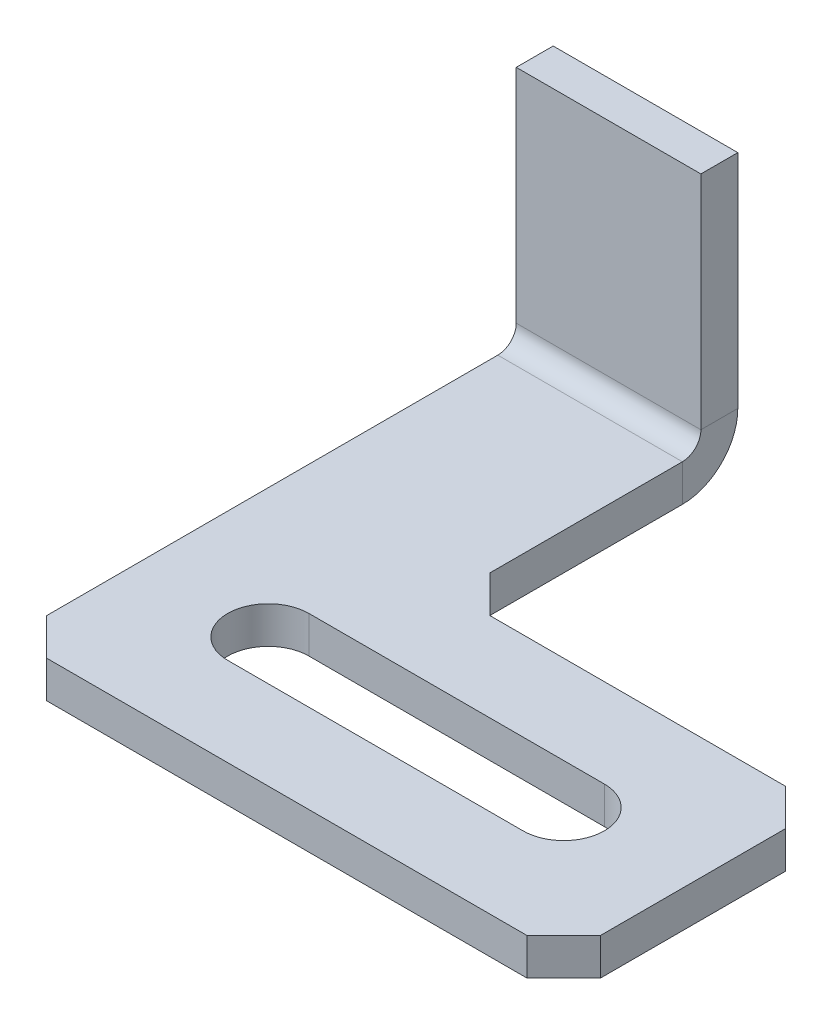
ISO-10303-21;
HEADER;
FILE_DESCRIPTION(('STEP AP214'),'2;1');
FILE_NAME('part.step','',(''),(''),'','','');
FILE_SCHEMA(('AUTOMOTIVE_DESIGN { 1 0 10303 214 1 1 1 1 }'));
ENDSEC;
DATA;
#1=APPLICATION_CONTEXT('core data for automotive mechanical design processes');
#2=APPLICATION_PROTOCOL_DEFINITION('international standard','automotive_design',2000,#1);
#3=PRODUCT_CONTEXT('',#1,'mechanical');
#4=PRODUCT('Part','Part','',(#3));
#5=PRODUCT_RELATED_PRODUCT_CATEGORY('part','',(#4));
#6=PRODUCT_DEFINITION_FORMATION('','',#4);
#7=PRODUCT_DEFINITION_CONTEXT('part definition',#1,'design');
#8=PRODUCT_DEFINITION('design','',#6,#7);
#9=PRODUCT_DEFINITION_SHAPE('','',#8);
#10=(LENGTH_UNIT() NAMED_UNIT(*) SI_UNIT(.MILLI.,.METRE.));
#11=(NAMED_UNIT(*) PLANE_ANGLE_UNIT() SI_UNIT($,.RADIAN.));
#12=(NAMED_UNIT(*) SI_UNIT($,.STERADIAN.) SOLID_ANGLE_UNIT());
#13=UNCERTAINTY_MEASURE_WITH_UNIT(LENGTH_MEASURE(1.E-05),#10,'distance_accuracy_value','');
#14=(GEOMETRIC_REPRESENTATION_CONTEXT(3) GLOBAL_UNCERTAINTY_ASSIGNED_CONTEXT((#13)) GLOBAL_UNIT_ASSIGNED_CONTEXT((#10,
#11,#12)) REPRESENTATION_CONTEXT('',''));
#15=CARTESIAN_POINT('',(0.,0.,0.));
#16=DIRECTION('',(0.,0.,1.));
#17=DIRECTION('',(1.,0.,0.));
#18=AXIS2_PLACEMENT_3D('',#15,#16,#17);
#19=CARTESIAN_POINT('',(7.5,-14.2853981633974,-14.7146018366026));
#20=DIRECTION('',(0.,0.,1.));
#21=DIRECTION('',(0.,-1.,0.));
#22=AXIS2_PLACEMENT_3D('',#19,#20,#21);
#23=PLANE('',#22);
#24=DIRECTION('',(-1.,0.,0.));
#25=VECTOR('',#24,1.);
#26=CARTESIAN_POINT('',(7.5,6.5,-14.7146018366025));
#27=LINE('',#26,#25);
#28=CARTESIAN_POINT('',(-2.5,6.5,-14.7146018366025));
#29=VERTEX_POINT('',#28);
#30=CARTESIAN_POINT('',(-7.5,6.5,-14.7146018366025));
#31=VERTEX_POINT('',#30);
#32=EDGE_CURVE('E141',#29,#31,#27,.T.);
#33=ORIENTED_EDGE('',*,*,#32,.F.);
#34=DIRECTION('',(0.,1.,0.));
#35=VECTOR('',#34,1.);
#36=CARTESIAN_POINT('',(-2.5,-14.2853981633974,-14.7146018366026));
#37=LINE('',#36,#35);
#38=CARTESIAN_POINT('',(-2.5,0.500000000000006,-14.7146018366025));
#39=VERTEX_POINT('',#38);
#40=EDGE_CURVE('E149',#39,#29,#37,.T.);
#41=ORIENTED_EDGE('',*,*,#40,.F.);
#42=DIRECTION('',(-1.,0.,0.));
#43=VECTOR('',#42,1.);
#44=CARTESIAN_POINT('',(7.5,0.500000000000006,-14.7146018366025));
#45=LINE('',#44,#43);
#46=CARTESIAN_POINT('',(-7.5,0.5,-14.7146018366025));
#47=VERTEX_POINT('',#46);
#48=EDGE_CURVE('E166',#39,#47,#45,.T.);
#49=ORIENTED_EDGE('',*,*,#48,.T.);
#50=DIRECTION('',(0.,1.,0.));
#51=VECTOR('',#50,1.);
#52=CARTESIAN_POINT('',(-7.5,-14.2853981633974,-14.7146018366026));
#53=LINE('',#52,#51);
#54=EDGE_CURVE('E151',#47,#31,#53,.T.);
#55=ORIENTED_EDGE('',*,*,#54,.T.);
#56=EDGE_LOOP('',(#33,#41,#49,#55));
#57=FACE_BOUND('',#56,.T.);
#58=ADVANCED_FACE('F17',(#57),#23,.F.);
#59=CARTESIAN_POINT('',(7.5,-14.2853981633974,-13.7146018366026));
#60=DIRECTION('',(0.,0.,1.));
#61=DIRECTION('',(0.,-1.,0.));
#62=AXIS2_PLACEMENT_3D('',#59,#60,#61);
#63=PLANE('',#62);
#64=DIRECTION('',(0.,1.,0.));
#65=VECTOR('',#64,1.);
#66=CARTESIAN_POINT('',(-2.5,-14.2853981633974,-13.7146018366026));
#67=LINE('',#66,#65);
#68=CARTESIAN_POINT('',(-2.5,0.5,-13.7146018366025));
#69=VERTEX_POINT('',#68);
#70=CARTESIAN_POINT('',(-2.5,6.5,-13.7146018366025));
#71=VERTEX_POINT('',#70);
#72=EDGE_CURVE('E165',#69,#71,#67,.T.);
#73=ORIENTED_EDGE('',*,*,#72,.T.);
#74=DIRECTION('',(-1.,0.,0.));
#75=VECTOR('',#74,1.);
#76=CARTESIAN_POINT('',(7.5,6.5,-13.7146018366025));
#77=LINE('',#76,#75);
#78=CARTESIAN_POINT('',(-7.5,6.5,-13.7146018366025));
#79=VERTEX_POINT('',#78);
#80=EDGE_CURVE('E32',#71,#79,#77,.T.);
#81=ORIENTED_EDGE('',*,*,#80,.T.);
#82=DIRECTION('',(0.,1.,0.));
#83=VECTOR('',#82,1.);
#84=CARTESIAN_POINT('',(-7.5,15.7146018366025,-13.7146018366025));
#85=LINE('',#84,#83);
#86=CARTESIAN_POINT('',(-7.5,0.5,-13.7146018366025));
#87=VERTEX_POINT('',#86);
#88=EDGE_CURVE('E38',#87,#79,#85,.T.);
#89=ORIENTED_EDGE('',*,*,#88,.F.);
#90=DIRECTION('',(-1.,0.,0.));
#91=VECTOR('',#90,1.);
#92=CARTESIAN_POINT('',(7.5,0.5,-13.7146018366025));
#93=LINE('',#92,#91);
#94=EDGE_CURVE('E170',#69,#87,#93,.T.);
#95=ORIENTED_EDGE('',*,*,#94,.F.);
#96=EDGE_LOOP('',(#73,#81,#89,#95));
#97=FACE_BOUND('',#96,.T.);
#98=ADVANCED_FACE('F332',(#97),#63,.T.);
#99=CARTESIAN_POINT('',(-7.5,15.7146018366025,-14.7146018366025));
#100=DIRECTION('',(-1.,0.,0.));
#101=DIRECTION('',(0.,1.,0.));
#102=AXIS2_PLACEMENT_3D('',#99,#100,#101);
#103=PLANE('',#102);
#104=ORIENTED_EDGE('',*,*,#88,.T.);
#105=DIRECTION('',(0.,0.,-1.));
#106=VECTOR('',#105,1.);
#107=CARTESIAN_POINT('',(-7.5,6.5,-14.7146018366025));
#108=LINE('',#107,#106);
#109=EDGE_CURVE('E152',#79,#31,#108,.T.);
#110=ORIENTED_EDGE('',*,*,#109,.T.);
#111=ORIENTED_EDGE('',*,*,#54,.F.);
#112=DIRECTION('',(0.,0.,-1.));
#113=VECTOR('',#112,1.);
#114=CARTESIAN_POINT('',(-7.5,0.500000000000006,-14.7146018366025));
#115=LINE('',#114,#113);
#116=EDGE_CURVE('E25',#87,#47,#115,.T.);
#117=ORIENTED_EDGE('',*,*,#116,.F.);
#118=EDGE_LOOP('',(#104,#110,#111,#117));
#119=FACE_BOUND('',#118,.T.);
#120=ADVANCED_FACE('F19',(#119),#103,.T.);
#121=CARTESIAN_POINT('',(-2.5,15.7146018366024,28.2303025023038));
#122=DIRECTION('',(1.,0.,0.));
#123=DIRECTION('',(0.,1.,0.));
#124=AXIS2_PLACEMENT_3D('',#121,#122,#123);
#125=PLANE('',#124);
#126=ORIENTED_EDGE('',*,*,#40,.T.);
#127=DIRECTION('',(0.,0.,1.));
#128=VECTOR('',#127,1.);
#129=CARTESIAN_POINT('',(-2.5,6.5,28.2303025023038));
#130=LINE('',#129,#128);
#131=EDGE_CURVE('E11',#29,#71,#130,.T.);
#132=ORIENTED_EDGE('',*,*,#131,.T.);
#133=ORIENTED_EDGE('',*,*,#72,.F.);
#134=DIRECTION('',(0.,0.,1.));
#135=VECTOR('',#134,1.);
#136=CARTESIAN_POINT('',(-2.5,0.499999999999858,28.2303025023038));
#137=LINE('',#136,#135);
#138=EDGE_CURVE('E156',#39,#69,#137,.T.);
#139=ORIENTED_EDGE('',*,*,#138,.F.);
#140=EDGE_LOOP('',(#126,#132,#133,#139));
#141=FACE_BOUND('',#140,.T.);
#142=ADVANCED_FACE('F154',(#141),#125,.T.);
#143=CARTESIAN_POINT('',(4.,-1.,-3.5));
#144=DIRECTION('',(0.,1.,0.));
#145=DIRECTION('',(0.,0.,1.));
#146=AXIS2_PLACEMENT_3D('',#143,#144,#145);
#147=CYLINDRICAL_SURFACE('',#146,1.1);
#148=CARTESIAN_POINT('',(4.,0.,-3.5));
#149=DIRECTION('',(0.,1.,0.));
#150=DIRECTION('',(0.,0.,1.));
#151=AXIS2_PLACEMENT_3D('',#148,#149,#150);
#152=CIRCLE('',#151,1.1);
#153=CARTESIAN_POINT('',(4.,0.,-2.4));
#154=VERTEX_POINT('',#153);
#155=CARTESIAN_POINT('',(4.,0.,-4.6));
#156=VERTEX_POINT('',#155);
#157=EDGE_CURVE('E194',#154,#156,#152,.T.);
#158=ORIENTED_EDGE('',*,*,#157,.T.);
#159=DIRECTION('',(0.,1.,0.));
#160=VECTOR('',#159,1.);
#161=CARTESIAN_POINT('',(4.,-1.,-4.6));
#162=LINE('',#161,#160);
#163=CARTESIAN_POINT('',(4.,-1.,-4.6));
#164=VERTEX_POINT('',#163);
#165=EDGE_CURVE('E282',#164,#156,#162,.T.);
#166=ORIENTED_EDGE('',*,*,#165,.F.);
#167=CARTESIAN_POINT('',(4.,-1.,-3.5));
#168=DIRECTION('',(0.,1.,0.));
#169=DIRECTION('',(0.,0.,1.));
#170=AXIS2_PLACEMENT_3D('',#167,#168,#169);
#171=CIRCLE('',#170,1.1);
#172=CARTESIAN_POINT('',(4.,-1.,-2.4));
#173=VERTEX_POINT('',#172);
#174=EDGE_CURVE('E241',#173,#164,#171,.T.);
#175=ORIENTED_EDGE('',*,*,#174,.F.);
#176=DIRECTION('',(0.,1.,0.));
#177=VECTOR('',#176,1.);
#178=CARTESIAN_POINT('',(4.,-1.,-2.4));
#179=LINE('',#178,#177);
#180=EDGE_CURVE('E297',#173,#154,#179,.T.);
#181=ORIENTED_EDGE('',*,*,#180,.T.);
#182=EDGE_LOOP('',(#158,#166,#175,#181));
#183=FACE_BOUND('',#182,.T.);
#184=ADVANCED_FACE('F303',(#183),#147,.F.);
#185=CARTESIAN_POINT('',(-4.,-1.,-2.4));
#186=DIRECTION('',(0.,0.,1.));
#187=DIRECTION('',(1.,0.,0.));
#188=AXIS2_PLACEMENT_3D('',#185,#186,#187);
#189=PLANE('',#188);
#190=DIRECTION('',(1.,0.,0.));
#191=VECTOR('',#190,1.);
#192=CARTESIAN_POINT('',(-4.,-1.,-2.4));
#193=LINE('',#192,#191);
#194=CARTESIAN_POINT('',(-4.,-1.,-2.4));
#195=VERTEX_POINT('',#194);
#196=EDGE_CURVE('E244',#195,#173,#193,.T.);
#197=ORIENTED_EDGE('',*,*,#196,.F.);
#198=DIRECTION('',(0.,1.,0.));
#199=VECTOR('',#198,1.);
#200=CARTESIAN_POINT('',(-4.,-1.,-2.4));
#201=LINE('',#200,#199);
#202=CARTESIAN_POINT('',(-4.,0.,-2.4));
#203=VERTEX_POINT('',#202);
#204=EDGE_CURVE('E294',#195,#203,#201,.T.);
#205=ORIENTED_EDGE('',*,*,#204,.T.);
#206=DIRECTION('',(1.,0.,0.));
#207=VECTOR('',#206,1.);
#208=CARTESIAN_POINT('',(7.5,0.,-2.4));
#209=LINE('',#208,#207);
#210=EDGE_CURVE('E292',#203,#154,#209,.T.);
#211=ORIENTED_EDGE('',*,*,#210,.T.);
#212=ORIENTED_EDGE('',*,*,#180,.F.);
#213=EDGE_LOOP('',(#197,#205,#211,#212));
#214=FACE_BOUND('',#213,.T.);
#215=ADVANCED_FACE('F320',(#214),#189,.F.);
#216=CARTESIAN_POINT('',(-4.,-1.,-3.5));
#217=DIRECTION('',(0.,1.,0.));
#218=DIRECTION('',(0.,0.,1.));
#219=AXIS2_PLACEMENT_3D('',#216,#217,#218);
#220=CYLINDRICAL_SURFACE('',#219,1.1);
#221=CARTESIAN_POINT('',(-4.,0.,-3.5));
#222=DIRECTION('',(0.,-1.,0.));
#223=DIRECTION('',(0.,0.,1.));
#224=AXIS2_PLACEMENT_3D('',#221,#222,#223);
#225=CIRCLE('',#224,1.1);
#226=CARTESIAN_POINT('',(-4.,0.,-4.6));
#227=VERTEX_POINT('',#226);
#228=EDGE_CURVE('E229',#203,#227,#225,.T.);
#229=ORIENTED_EDGE('',*,*,#228,.F.);
#230=ORIENTED_EDGE('',*,*,#204,.F.);
#231=CARTESIAN_POINT('',(-4.,-1.,-3.5));
#232=DIRECTION('',(0.,-1.,0.));
#233=DIRECTION('',(0.,0.,1.));
#234=AXIS2_PLACEMENT_3D('',#231,#232,#233);
#235=CIRCLE('',#234,1.1);
#236=CARTESIAN_POINT('',(-4.,-1.,-4.6));
#237=VERTEX_POINT('',#236);
#238=EDGE_CURVE('E289',#195,#237,#235,.T.);
#239=ORIENTED_EDGE('',*,*,#238,.T.);
#240=DIRECTION('',(0.,1.,0.));
#241=VECTOR('',#240,1.);
#242=CARTESIAN_POINT('',(-4.,-1.,-4.6));
#243=LINE('',#242,#241);
#244=EDGE_CURVE('E286',#237,#227,#243,.T.);
#245=ORIENTED_EDGE('',*,*,#244,.T.);
#246=EDGE_LOOP('',(#229,#230,#239,#245));
#247=FACE_BOUND('',#246,.T.);
#248=ADVANCED_FACE('F314',(#247),#220,.F.);
#249=CARTESIAN_POINT('',(-4.,-1.,-4.6));
#250=DIRECTION('',(0.,0.,-1.));
#251=DIRECTION('',(-1.,0.,0.));
#252=AXIS2_PLACEMENT_3D('',#249,#250,#251);
#253=PLANE('',#252);
#254=DIRECTION('',(-1.,0.,0.));
#255=VECTOR('',#254,1.);
#256=CARTESIAN_POINT('',(-4.,0.,-4.6));
#257=LINE('',#256,#255);
#258=EDGE_CURVE('E284',#156,#227,#257,.T.);
#259=ORIENTED_EDGE('',*,*,#258,.T.);
#260=ORIENTED_EDGE('',*,*,#244,.F.);
#261=DIRECTION('',(-1.,0.,0.));
#262=VECTOR('',#261,1.);
#263=CARTESIAN_POINT('',(-4.,-1.,-4.6));
#264=LINE('',#263,#262);
#265=EDGE_CURVE('E247',#164,#237,#264,.T.);
#266=ORIENTED_EDGE('',*,*,#265,.F.);
#267=ORIENTED_EDGE('',*,*,#165,.T.);
#268=EDGE_LOOP('',(#259,#260,#266,#267));
#269=FACE_BOUND('',#268,.T.);
#270=ADVANCED_FACE('F312',(#269),#253,.F.);
#271=CARTESIAN_POINT('',(-7.5,-1.,-1.));
#272=DIRECTION('',(0.707106781186547,0.,-0.707106781186549));
#273=DIRECTION('',(-0.707106781186549,0.,-0.707106781186546));
#274=AXIS2_PLACEMENT_3D('',#271,#272,#273);
#275=PLANE('',#274);
#276=DIRECTION('',(0.707106781186549,0.,0.707106781186546));
#277=VECTOR('',#276,1.);
#278=CARTESIAN_POINT('',(-7.5,-1.,-1.));
#279=LINE('',#278,#277);
#280=CARTESIAN_POINT('',(-6.5,-1.,0.));
#281=VERTEX_POINT('',#280);
#282=CARTESIAN_POINT('',(-7.5,-1.,-1.));
#283=VERTEX_POINT('',#282);
#284=EDGE_CURVE('E251',#281,#283,#279,.F.);
#285=ORIENTED_EDGE('',*,*,#284,.F.);
#286=DIRECTION('',(0.,-1.,0.));
#287=VECTOR('',#286,1.);
#288=CARTESIAN_POINT('',(-6.5,-1.,0.));
#289=LINE('',#288,#287);
#290=CARTESIAN_POINT('',(-6.5,0.,0.));
#291=VERTEX_POINT('',#290);
#292=EDGE_CURVE('E280',#291,#281,#289,.T.);
#293=ORIENTED_EDGE('',*,*,#292,.F.);
#294=DIRECTION('',(-0.707106781186549,0.,-0.707106781186546));
#295=VECTOR('',#294,1.);
#296=CARTESIAN_POINT('',(0.50000000000003,0.,7.));
#297=LINE('',#296,#295);
#298=CARTESIAN_POINT('',(-7.5,0.,-1.00000000000002));
#299=VERTEX_POINT('',#298);
#300=EDGE_CURVE('E221',#299,#291,#297,.F.);
#301=ORIENTED_EDGE('',*,*,#300,.F.);
#302=DIRECTION('',(0.,1.,0.));
#303=VECTOR('',#302,1.);
#304=CARTESIAN_POINT('',(-7.5,-1.,-1.));
#305=LINE('',#304,#303);
#306=EDGE_CURVE('E158',#283,#299,#305,.T.);
#307=ORIENTED_EDGE('',*,*,#306,.F.);
#308=EDGE_LOOP('',(#285,#293,#301,#307));
#309=FACE_BOUND('',#308,.T.);
#310=ADVANCED_FACE('F388',(#309),#275,.F.);
#311=CARTESIAN_POINT('',(0.,-1.,0.));
#312=DIRECTION('',(0.,0.,1.));
#313=DIRECTION('',(1.,0.,0.));
#314=AXIS2_PLACEMENT_3D('',#311,#312,#313);
#315=PLANE('',#314);
#316=DIRECTION('',(1.,0.,0.));
#317=VECTOR('',#316,1.);
#318=CARTESIAN_POINT('',(0.,0.,0.));
#319=LINE('',#318,#317);
#320=CARTESIAN_POINT('',(6.5,0.,0.));
#321=VERTEX_POINT('',#320);
#322=EDGE_CURVE('E218',#291,#321,#319,.T.);
#323=ORIENTED_EDGE('',*,*,#322,.F.);
#324=ORIENTED_EDGE('',*,*,#292,.T.);
#325=DIRECTION('',(1.,0.,0.));
#326=VECTOR('',#325,1.);
#327=CARTESIAN_POINT('',(0.,-1.,0.));
#328=LINE('',#327,#326);
#329=CARTESIAN_POINT('',(6.5,-1.,0.));
#330=VERTEX_POINT('',#329);
#331=EDGE_CURVE('E277',#281,#330,#328,.T.);
#332=ORIENTED_EDGE('',*,*,#331,.T.);
#333=DIRECTION('',(0.,1.,0.));
#334=VECTOR('',#333,1.);
#335=CARTESIAN_POINT('',(6.5,-1.,0.));
#336=LINE('',#335,#334);
#337=EDGE_CURVE('E274',#330,#321,#336,.T.);
#338=ORIENTED_EDGE('',*,*,#337,.T.);
#339=EDGE_LOOP('',(#323,#324,#332,#338));
#340=FACE_BOUND('',#339,.T.);
#341=ADVANCED_FACE('F398',(#340),#315,.T.);
#342=CARTESIAN_POINT('',(6.5,-1.,0.));
#343=DIRECTION('',(-0.707106781186549,0.,-0.707106781186547));
#344=DIRECTION('',(-0.707106781186546,0.,0.707106781186549));
#345=AXIS2_PLACEMENT_3D('',#342,#343,#344);
#346=PLANE('',#345);
#347=DIRECTION('',(0.707106781186546,0.,-0.707106781186549));
#348=VECTOR('',#347,1.);
#349=CARTESIAN_POINT('',(6.5,-1.,0.));
#350=LINE('',#349,#348);
#351=CARTESIAN_POINT('',(7.5,-1.,-1.));
#352=VERTEX_POINT('',#351);
#353=EDGE_CURVE('E253',#352,#330,#350,.F.);
#354=ORIENTED_EDGE('',*,*,#353,.F.);
#355=DIRECTION('',(0.,-1.,0.));
#356=VECTOR('',#355,1.);
#357=CARTESIAN_POINT('',(7.5,-1.,-1.));
#358=LINE('',#357,#356);
#359=CARTESIAN_POINT('',(7.5,0.,-1.));
#360=VERTEX_POINT('',#359);
#361=EDGE_CURVE('E272',#360,#352,#358,.T.);
#362=ORIENTED_EDGE('',*,*,#361,.F.);
#363=DIRECTION('',(-0.707106781186546,0.,0.707106781186549));
#364=VECTOR('',#363,1.);
#365=CARTESIAN_POINT('',(7.,0.,-0.5));
#366=LINE('',#365,#364);
#367=EDGE_CURVE('E216',#321,#360,#366,.F.);
#368=ORIENTED_EDGE('',*,*,#367,.F.);
#369=ORIENTED_EDGE('',*,*,#337,.F.);
#370=EDGE_LOOP('',(#354,#362,#368,#369));
#371=FACE_BOUND('',#370,.T.);
#372=ADVANCED_FACE('F408',(#371),#346,.F.);
#373=CARTESIAN_POINT('',(7.5,-1.,-30.));
#374=DIRECTION('',(1.,0.,0.));
#375=DIRECTION('',(0.,0.,-1.));
#376=AXIS2_PLACEMENT_3D('',#373,#374,#375);
#377=PLANE('',#376);
#378=DIRECTION('',(0.,0.,-1.));
#379=VECTOR('',#378,1.);
#380=CARTESIAN_POINT('',(7.5,0.,-30.));
#381=LINE('',#380,#379);
#382=CARTESIAN_POINT('',(7.5,0.,-6.));
#383=VERTEX_POINT('',#382);
#384=EDGE_CURVE('E213',#360,#383,#381,.T.);
#385=ORIENTED_EDGE('',*,*,#384,.F.);
#386=ORIENTED_EDGE('',*,*,#361,.T.);
#387=DIRECTION('',(0.,0.,-1.));
#388=VECTOR('',#387,1.);
#389=CARTESIAN_POINT('',(7.5,-1.,0.));
#390=LINE('',#389,#388);
#391=CARTESIAN_POINT('',(7.5,-1.,-6.));
#392=VERTEX_POINT('',#391);
#393=EDGE_CURVE('E269',#352,#392,#390,.T.);
#394=ORIENTED_EDGE('',*,*,#393,.T.);
#395=DIRECTION('',(0.,1.,0.));
#396=VECTOR('',#395,1.);
#397=CARTESIAN_POINT('',(7.5,-1.,-6.));
#398=LINE('',#397,#396);
#399=EDGE_CURVE('E267',#392,#383,#398,.T.);
#400=ORIENTED_EDGE('',*,*,#399,.T.);
#401=EDGE_LOOP('',(#385,#386,#394,#400));
#402=FACE_BOUND('',#401,.T.);
#403=ADVANCED_FACE('F418',(#402),#377,.T.);
#404=CARTESIAN_POINT('',(6.5,41.9449043389063,-7.));
#405=DIRECTION('',(-0.707106781186549,0.,0.707106781186547));
#406=DIRECTION('',(0.707106781186547,0.,0.707106781186549));
#407=AXIS2_PLACEMENT_3D('',#404,#405,#406);
#408=PLANE('',#407);
#409=DIRECTION('',(0.707106781186547,0.,0.707106781186549));
#410=VECTOR('',#409,1.);
#411=CARTESIAN_POINT('',(10.5,0.,-3.));
#412=LINE('',#411,#410);
#413=CARTESIAN_POINT('',(6.5,0.,-7.));
#414=VERTEX_POINT('',#413);
#415=EDGE_CURVE('E211',#383,#414,#412,.F.);
#416=ORIENTED_EDGE('',*,*,#415,.F.);
#417=ORIENTED_EDGE('',*,*,#399,.F.);
#418=DIRECTION('',(-0.707106781186547,0.,-0.707106781186549));
#419=VECTOR('',#418,1.);
#420=CARTESIAN_POINT('',(6.5,-1.,-7.));
#421=LINE('',#420,#419);
#422=CARTESIAN_POINT('',(6.5,-1.,-7.));
#423=VERTEX_POINT('',#422);
#424=EDGE_CURVE('E255',#423,#392,#421,.F.);
#425=ORIENTED_EDGE('',*,*,#424,.F.);
#426=DIRECTION('',(0.,-1.,0.));
#427=VECTOR('',#426,1.);
#428=CARTESIAN_POINT('',(6.5,41.9449043389063,-7.));
#429=LINE('',#428,#427);
#430=EDGE_CURVE('E264',#414,#423,#429,.T.);
#431=ORIENTED_EDGE('',*,*,#430,.F.);
#432=EDGE_LOOP('',(#416,#417,#425,#431));
#433=FACE_BOUND('',#432,.T.);
#434=ADVANCED_FACE('F428',(#433),#408,.F.);
#435=CARTESIAN_POINT('',(-2.5,41.9449043389063,-7.));
#436=DIRECTION('',(0.,0.,-1.));
#437=DIRECTION('',(-1.,0.,0.));
#438=AXIS2_PLACEMENT_3D('',#435,#436,#437);
#439=PLANE('',#438);
#440=DIRECTION('',(-1.,0.,0.));
#441=VECTOR('',#440,1.);
#442=CARTESIAN_POINT('',(7.5,0.,-7.));
#443=LINE('',#442,#441);
#444=CARTESIAN_POINT('',(-1.5,0.,-7.));
#445=VERTEX_POINT('',#444);
#446=EDGE_CURVE('E208',#414,#445,#443,.T.);
#447=ORIENTED_EDGE('',*,*,#446,.F.);
#448=ORIENTED_EDGE('',*,*,#430,.T.);
#449=DIRECTION('',(-1.,0.,0.));
#450=VECTOR('',#449,1.);
#451=CARTESIAN_POINT('',(7.5,-1.,-7.));
#452=LINE('',#451,#450);
#453=CARTESIAN_POINT('',(-1.5,-1.,-7.));
#454=VERTEX_POINT('',#453);
#455=EDGE_CURVE('E261',#423,#454,#452,.T.);
#456=ORIENTED_EDGE('',*,*,#455,.T.);
#457=DIRECTION('',(0.,1.,0.));
#458=VECTOR('',#457,1.);
#459=CARTESIAN_POINT('',(-1.5,0.,-7.));
#460=LINE('',#459,#458);
#461=EDGE_CURVE('E259',#454,#445,#460,.T.);
#462=ORIENTED_EDGE('',*,*,#461,.T.);
#463=EDGE_LOOP('',(#447,#448,#456,#462));
#464=FACE_BOUND('',#463,.T.);
#465=ADVANCED_FACE('F438',(#464),#439,.T.);
#466=CARTESIAN_POINT('',(-2.5,41.9449043389063,-8.));
#467=DIRECTION('',(0.707106781186552,0.,-0.707106781186544));
#468=DIRECTION('',(-0.707106781186544,0.,-0.707106781186552));
#469=AXIS2_PLACEMENT_3D('',#466,#467,#468);
#470=PLANE('',#469);
#471=DIRECTION('',(0.707106781186544,0.,0.707106781186552));
#472=VECTOR('',#471,1.);
#473=CARTESIAN_POINT('',(-2.5,0.,-8.));
#474=LINE('',#473,#472);
#475=CARTESIAN_POINT('',(-2.5,0.,-8.));
#476=VERTEX_POINT('',#475);
#477=EDGE_CURVE('E206',#445,#476,#474,.F.);
#478=ORIENTED_EDGE('',*,*,#477,.F.);
#479=ORIENTED_EDGE('',*,*,#461,.F.);
#480=DIRECTION('',(-0.707106781186544,0.,-0.707106781186552));
#481=VECTOR('',#480,1.);
#482=CARTESIAN_POINT('',(6.5,-1.,1.00000000000004));
#483=LINE('',#482,#481);
#484=CARTESIAN_POINT('',(-2.5,-1.,-8.));
#485=VERTEX_POINT('',#484);
#486=EDGE_CURVE('E257',#485,#454,#483,.F.);
#487=ORIENTED_EDGE('',*,*,#486,.F.);
#488=DIRECTION('',(0.,-1.,0.));
#489=VECTOR('',#488,1.);
#490=CARTESIAN_POINT('',(-2.5,-1.,-8.));
#491=LINE('',#490,#489);
#492=EDGE_CURVE('E232',#476,#485,#491,.T.);
#493=ORIENTED_EDGE('',*,*,#492,.F.);
#494=EDGE_LOOP('',(#478,#479,#487,#493));
#495=FACE_BOUND('',#494,.T.);
#496=ADVANCED_FACE('F448',(#495),#470,.T.);
#497=CARTESIAN_POINT('',(7.5,-1.,0.));
#498=DIRECTION('',(0.,1.,0.));
#499=DIRECTION('',(0.,0.,1.));
#500=AXIS2_PLACEMENT_3D('',#497,#498,#499);
#501=PLANE('',#500);
#502=DIRECTION('',(-1.,0.,0.));
#503=VECTOR('',#502,1.);
#504=CARTESIAN_POINT('',(7.5,-1.,-13.2146018366025));
#505=LINE('',#504,#503);
#506=CARTESIAN_POINT('',(-2.5,-1.,-13.2146018366025));
#507=VERTEX_POINT('',#506);
#508=CARTESIAN_POINT('',(-7.5,-1.,-13.2146018366025));
#509=VERTEX_POINT('',#508);
#510=EDGE_CURVE('E173',#507,#509,#505,.T.);
#511=ORIENTED_EDGE('',*,*,#510,.F.);
#512=DIRECTION('',(0.,0.,-1.));
#513=VECTOR('',#512,1.);
#514=CARTESIAN_POINT('',(-2.5,-1.,0.));
#515=LINE('',#514,#513);
#516=EDGE_CURVE('E238',#485,#507,#515,.T.);
#517=ORIENTED_EDGE('',*,*,#516,.F.);
#518=ORIENTED_EDGE('',*,*,#486,.T.);
#519=ORIENTED_EDGE('',*,*,#455,.F.);
#520=ORIENTED_EDGE('',*,*,#424,.T.);
#521=ORIENTED_EDGE('',*,*,#393,.F.);
#522=ORIENTED_EDGE('',*,*,#353,.T.);
#523=ORIENTED_EDGE('',*,*,#331,.F.);
#524=ORIENTED_EDGE('',*,*,#284,.T.);
#525=DIRECTION('',(0.,0.,-1.));
#526=VECTOR('',#525,1.);
#527=CARTESIAN_POINT('',(-7.5,-1.,0.));
#528=LINE('',#527,#526);
#529=EDGE_CURVE('E249',#283,#509,#528,.T.);
#530=ORIENTED_EDGE('',*,*,#529,.T.);
#531=EDGE_LOOP('',(#511,#517,#518,#519,#520,#521,#522,#523,#524,#530));
#532=FACE_BOUND('',#531,.T.);
#533=ORIENTED_EDGE('',*,*,#265,.T.);
#534=ORIENTED_EDGE('',*,*,#238,.F.);
#535=ORIENTED_EDGE('',*,*,#196,.T.);
#536=ORIENTED_EDGE('',*,*,#174,.T.);
#537=EDGE_LOOP('',(#533,#534,#535,#536));
#538=FACE_BOUND('',#537,.T.);
#539=ADVANCED_FACE('F318',(#532,#538),#501,.F.);
#540=CARTESIAN_POINT('',(-2.5,41.9449043389063,-30.));
#541=DIRECTION('',(1.,0.,0.));
#542=DIRECTION('',(0.,0.,-1.));
#543=AXIS2_PLACEMENT_3D('',#540,#541,#542);
#544=PLANE('',#543);
#545=ORIENTED_EDGE('',*,*,#516,.T.);
#546=DIRECTION('',(0.,1.,0.));
#547=VECTOR('',#546,1.);
#548=CARTESIAN_POINT('',(-2.5,41.9449043389063,-13.2146018366026));
#549=LINE('',#548,#547);
#550=CARTESIAN_POINT('',(-2.5,0.,-13.2146018366025));
#551=VERTEX_POINT('',#550);
#552=EDGE_CURVE('E235',#507,#551,#549,.T.);
#553=ORIENTED_EDGE('',*,*,#552,.T.);
#554=DIRECTION('',(0.,0.,-1.));
#555=VECTOR('',#554,1.);
#556=CARTESIAN_POINT('',(-2.5,0.,0.));
#557=LINE('',#556,#555);
#558=EDGE_CURVE('E226',#476,#551,#557,.T.);
#559=ORIENTED_EDGE('',*,*,#558,.F.);
#560=ORIENTED_EDGE('',*,*,#492,.T.);
#561=EDGE_LOOP('',(#545,#553,#559,#560));
#562=FACE_BOUND('',#561,.T.);
#563=ADVANCED_FACE('F467',(#562),#544,.T.);
#564=CARTESIAN_POINT('',(7.5,0.,0.));
#565=DIRECTION('',(0.,1.,0.));
#566=DIRECTION('',(0.,0.,1.));
#567=AXIS2_PLACEMENT_3D('',#564,#565,#566);
#568=PLANE('',#567);
#569=ORIENTED_EDGE('',*,*,#228,.T.);
#570=ORIENTED_EDGE('',*,*,#258,.F.);
#571=ORIENTED_EDGE('',*,*,#157,.F.);
#572=ORIENTED_EDGE('',*,*,#210,.F.);
#573=EDGE_LOOP('',(#569,#570,#571,#572));
#574=FACE_BOUND('',#573,.T.);
#575=ORIENTED_EDGE('',*,*,#558,.T.);
#576=DIRECTION('',(-1.,0.,0.));
#577=VECTOR('',#576,1.);
#578=CARTESIAN_POINT('',(7.5,0.,-13.2146018366025));
#579=LINE('',#578,#577);
#580=CARTESIAN_POINT('',(-7.5,0.,-13.2146018366025));
#581=VERTEX_POINT('',#580);
#582=EDGE_CURVE('E223',#551,#581,#579,.T.);
#583=ORIENTED_EDGE('',*,*,#582,.T.);
#584=DIRECTION('',(0.,0.,-1.));
#585=VECTOR('',#584,1.);
#586=CARTESIAN_POINT('',(-7.5,0.,-30.));
#587=LINE('',#586,#585);
#588=EDGE_CURVE('E203',#299,#581,#587,.T.);
#589=ORIENTED_EDGE('',*,*,#588,.F.);
#590=ORIENTED_EDGE('',*,*,#300,.T.);
#591=ORIENTED_EDGE('',*,*,#322,.T.);
#592=ORIENTED_EDGE('',*,*,#367,.T.);
#593=ORIENTED_EDGE('',*,*,#384,.T.);
#594=ORIENTED_EDGE('',*,*,#415,.T.);
#595=ORIENTED_EDGE('',*,*,#446,.T.);
#596=ORIENTED_EDGE('',*,*,#477,.T.);
#597=EDGE_LOOP('',(#575,#583,#589,#590,#591,#592,#593,#594,#595,#596));
#598=FACE_BOUND('',#597,.T.);
#599=ADVANCED_FACE('F307',(#574,#598),#568,.T.);
#600=CARTESIAN_POINT('',(-7.5,-1.,-30.));
#601=DIRECTION('',(-1.,0.,0.));
#602=DIRECTION('',(0.,0.,-1.));
#603=AXIS2_PLACEMENT_3D('',#600,#601,#602);
#604=PLANE('',#603);
#605=ORIENTED_EDGE('',*,*,#588,.T.);
#606=DIRECTION('',(0.,-1.,0.));
#607=VECTOR('',#606,1.);
#608=CARTESIAN_POINT('',(-7.5,-1.,-13.2146018366025));
#609=LINE('',#608,#607);
#610=EDGE_CURVE('E162',#581,#509,#609,.T.);
#611=ORIENTED_EDGE('',*,*,#610,.T.);
#612=ORIENTED_EDGE('',*,*,#529,.F.);
#613=ORIENTED_EDGE('',*,*,#306,.T.);
#614=EDGE_LOOP('',(#605,#611,#612,#613));
#615=FACE_BOUND('',#614,.T.);
#616=ADVANCED_FACE('F340',(#615),#604,.T.);
#617=CARTESIAN_POINT('',(-2.5,0.5,-13.2146018366025));
#618=DIRECTION('',(1.,0.,0.));
#619=DIRECTION('',(0.,0.,-1.));
#620=AXIS2_PLACEMENT_3D('',#617,#618,#619);
#621=PLANE('',#620);
#622=ORIENTED_EDGE('',*,*,#138,.T.);
#623=CARTESIAN_POINT('',(-2.5,0.5,-13.2146018366025));
#624=DIRECTION('',(1.,0.,0.));
#625=DIRECTION('',(0.,0.,-1.));
#626=AXIS2_PLACEMENT_3D('',#623,#624,#625);
#627=CIRCLE('',#626,0.5);
#628=EDGE_CURVE('E199',#69,#551,#627,.F.);
#629=ORIENTED_EDGE('',*,*,#628,.T.);
#630=ORIENTED_EDGE('',*,*,#552,.F.);
#631=CARTESIAN_POINT('',(-2.5,0.5,-13.2146018366025));
#632=DIRECTION('',(-1.,0.,0.));
#633=DIRECTION('',(0.,0.,-1.));
#634=AXIS2_PLACEMENT_3D('',#631,#632,#633);
#635=CIRCLE('',#634,1.5);
#636=EDGE_CURVE('E192',#39,#507,#635,.T.);
#637=ORIENTED_EDGE('',*,*,#636,.F.);
#638=EDGE_LOOP('',(#622,#629,#630,#637));
#639=FACE_BOUND('',#638,.T.);
#640=ADVANCED_FACE('F493',(#639),#621,.T.);
#641=CARTESIAN_POINT('',(-7.5,0.5,-13.2146018366025));
#642=DIRECTION('',(-1.,0.,0.));
#643=DIRECTION('',(0.,0.,1.));
#644=AXIS2_PLACEMENT_3D('',#641,#642,#643);
#645=PLANE('',#644);
#646=ORIENTED_EDGE('',*,*,#610,.F.);
#647=CARTESIAN_POINT('',(-7.5,0.5,-13.2146018366025));
#648=DIRECTION('',(1.,0.,0.));
#649=DIRECTION('',(0.,0.,-1.));
#650=AXIS2_PLACEMENT_3D('',#647,#648,#649);
#651=CIRCLE('',#650,0.5);
#652=EDGE_CURVE('E186',#581,#87,#651,.T.);
#653=ORIENTED_EDGE('',*,*,#652,.T.);
#654=ORIENTED_EDGE('',*,*,#116,.T.);
#655=CARTESIAN_POINT('',(-7.5,0.5,-13.2146018366025));
#656=DIRECTION('',(1.,0.,0.));
#657=DIRECTION('',(0.,0.,-1.));
#658=AXIS2_PLACEMENT_3D('',#655,#656,#657);
#659=CIRCLE('',#658,1.5);
#660=EDGE_CURVE('E183',#509,#47,#659,.T.);
#661=ORIENTED_EDGE('',*,*,#660,.F.);
#662=EDGE_LOOP('',(#646,#653,#654,#661));
#663=FACE_BOUND('',#662,.T.);
#664=ADVANCED_FACE('F182',(#663),#645,.T.);
#665=CARTESIAN_POINT('',(-10.3354850857511,0.5,-13.2146018366025));
#666=DIRECTION('',(1.,0.,0.));
#667=DIRECTION('',(0.,0.,-1.));
#668=AXIS2_PLACEMENT_3D('',#665,#666,#667);
#669=CYLINDRICAL_SURFACE('',#668,1.5);
#670=ORIENTED_EDGE('',*,*,#660,.T.);
#671=ORIENTED_EDGE('',*,*,#48,.F.);
#672=ORIENTED_EDGE('',*,*,#636,.T.);
#673=ORIENTED_EDGE('',*,*,#510,.T.);
#674=EDGE_LOOP('',(#670,#671,#672,#673));
#675=FACE_BOUND('',#674,.T.);
#676=ADVANCED_FACE('F189',(#675),#669,.T.);
#677=CARTESIAN_POINT('',(-10.3354850857511,0.5,-13.2146018366025));
#678=DIRECTION('',(1.,0.,0.));
#679=DIRECTION('',(0.,0.,-1.));
#680=AXIS2_PLACEMENT_3D('',#677,#678,#679);
#681=CYLINDRICAL_SURFACE('',#680,0.5);
#682=ORIENTED_EDGE('',*,*,#652,.F.);
#683=ORIENTED_EDGE('',*,*,#582,.F.);
#684=ORIENTED_EDGE('',*,*,#628,.F.);
#685=ORIENTED_EDGE('',*,*,#94,.T.);
#686=EDGE_LOOP('',(#682,#683,#684,#685));
#687=FACE_BOUND('',#686,.T.);
#688=ADVANCED_FACE('F518',(#687),#681,.F.);
#689=CARTESIAN_POINT('',(1.55262957207901,6.5,-51.9551685328995));
#690=DIRECTION('',(0.,1.,0.));
#691=DIRECTION('',(0.,0.,1.));
#692=AXIS2_PLACEMENT_3D('',#689,#690,#691);
#693=PLANE('',#692);
#694=ORIENTED_EDGE('',*,*,#109,.F.);
#695=ORIENTED_EDGE('',*,*,#80,.F.);
#696=ORIENTED_EDGE('',*,*,#131,.F.);
#697=ORIENTED_EDGE('',*,*,#32,.T.);
#698=EDGE_LOOP('',(#694,#695,#696,#697));
#699=FACE_BOUND('',#698,.T.);
#700=ADVANCED_FACE('F140',(#699),#693,.T.);
#701=CLOSED_SHELL('',(#58,#98,#120,#142,#184,#215,#248,#270,#310,#341,#372,#403,#434,#465,#496,
#539,#563,#599,#616,#640,#664,#676,#688,#700));
#702=MANIFOLD_SOLID_BREP('B1',#701);
#703=ADVANCED_BREP_SHAPE_REPRESENTATION('',(#18,#702),#14);
#704=SHAPE_DEFINITION_REPRESENTATION(#9,#703);
ENDSEC;
END-ISO-10303-21;
